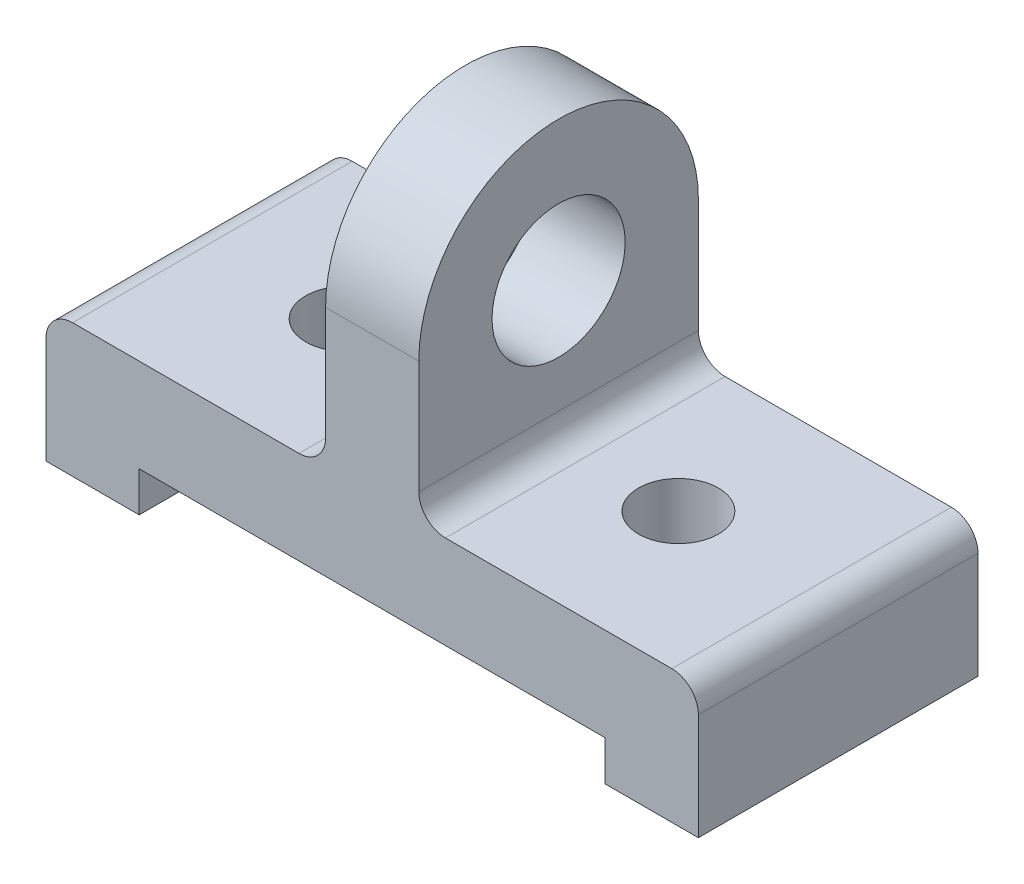
ISO-10303-21;
HEADER;
FILE_DESCRIPTION(('STEP AP214'),'2;1');
FILE_NAME('part.step','',(''),(''),'','','');
FILE_SCHEMA(('AUTOMOTIVE_DESIGN { 1 0 10303 214 1 1 1 1 }'));
ENDSEC;
DATA;
#1=APPLICATION_CONTEXT('core data for automotive mechanical design processes');
#2=APPLICATION_PROTOCOL_DEFINITION('international standard','automotive_design',2000,#1);
#3=PRODUCT_CONTEXT('',#1,'mechanical');
#4=PRODUCT('Part','Part','',(#3));
#5=PRODUCT_RELATED_PRODUCT_CATEGORY('part','',(#4));
#6=PRODUCT_DEFINITION_FORMATION('','',#4);
#7=PRODUCT_DEFINITION_CONTEXT('part definition',#1,'design');
#8=PRODUCT_DEFINITION('design','',#6,#7);
#9=PRODUCT_DEFINITION_SHAPE('','',#8);
#10=(LENGTH_UNIT() NAMED_UNIT(*) SI_UNIT(.MILLI.,.METRE.));
#11=(NAMED_UNIT(*) PLANE_ANGLE_UNIT() SI_UNIT($,.RADIAN.));
#12=(NAMED_UNIT(*) SI_UNIT($,.STERADIAN.) SOLID_ANGLE_UNIT());
#13=UNCERTAINTY_MEASURE_WITH_UNIT(LENGTH_MEASURE(1.E-05),#10,'distance_accuracy_value','');
#14=(GEOMETRIC_REPRESENTATION_CONTEXT(3) GLOBAL_UNCERTAINTY_ASSIGNED_CONTEXT((#13)) GLOBAL_UNIT_ASSIGNED_CONTEXT((#10,
#11,#12)) REPRESENTATION_CONTEXT('',''));
#15=CARTESIAN_POINT('',(0.,0.,0.));
#16=DIRECTION('',(0.,0.,1.));
#17=DIRECTION('',(1.,0.,0.));
#18=AXIS2_PLACEMENT_3D('',#15,#16,#17);
#19=CARTESIAN_POINT('',(0.,0.,42.));
#20=DIRECTION('',(0.,1.,0.));
#21=DIRECTION('',(-1.,0.,0.));
#22=AXIS2_PLACEMENT_3D('',#19,#20,#21);
#23=PLANE('',#22);
#24=CARTESIAN_POINT('',(-10.,0.,21.));
#25=DIRECTION('',(0.,1.,0.));
#26=DIRECTION('',(-1.,0.,0.));
#27=AXIS2_PLACEMENT_3D('',#24,#25,#26);
#28=CIRCLE('',#27,6.);
#29=CARTESIAN_POINT('',(-16.,0.,21.));
#30=VERTEX_POINT('',#29);
#31=EDGE_CURVE('E262',#30,#30,#28,.T.);
#32=ORIENTED_EDGE('',*,*,#31,.T.);
#33=EDGE_LOOP('',(#32));
#34=FACE_BOUND('',#33,.T.);
#35=DIRECTION('',(1.,0.,0.));
#36=VECTOR('',#35,1.);
#37=CARTESIAN_POINT('',(0.,0.,0.));
#38=LINE('',#37,#36);
#39=CARTESIAN_POINT('',(-70.,0.,0.));
#40=VERTEX_POINT('',#39);
#41=CARTESIAN_POINT('',(0.,0.,0.));
#42=VERTEX_POINT('',#41);
#43=EDGE_CURVE('E164',#40,#42,#38,.T.);
#44=ORIENTED_EDGE('',*,*,#43,.T.);
#45=DIRECTION('',(0.,0.,-1.));
#46=VECTOR('',#45,1.);
#47=CARTESIAN_POINT('',(0.,0.,42.));
#48=LINE('',#47,#46);
#49=CARTESIAN_POINT('',(0.,0.,42.));
#50=VERTEX_POINT('',#49);
#51=EDGE_CURVE('E322',#50,#42,#48,.T.);
#52=ORIENTED_EDGE('',*,*,#51,.F.);
#53=DIRECTION('',(1.,0.,0.));
#54=VECTOR('',#53,1.);
#55=CARTESIAN_POINT('',(0.,0.,42.));
#56=LINE('',#55,#54);
#57=CARTESIAN_POINT('',(-70.,0.,42.));
#58=VERTEX_POINT('',#57);
#59=EDGE_CURVE('E281',#58,#50,#56,.T.);
#60=ORIENTED_EDGE('',*,*,#59,.F.);
#61=DIRECTION('',(0.,0.,-1.));
#62=VECTOR('',#61,1.);
#63=CARTESIAN_POINT('',(-70.,0.,42.));
#64=LINE('',#63,#62);
#65=EDGE_CURVE('E228',#58,#40,#64,.T.);
#66=ORIENTED_EDGE('',*,*,#65,.T.);
#67=EDGE_LOOP('',(#44,#52,#60,#66));
#68=FACE_BOUND('',#67,.T.);
#69=CARTESIAN_POINT('',(-60.,0.,21.));
#70=DIRECTION('',(0.,-1.,0.));
#71=DIRECTION('',(1.,0.,0.));
#72=AXIS2_PLACEMENT_3D('',#69,#70,#71);
#73=CIRCLE('',#72,6.);
#74=CARTESIAN_POINT('',(-54.,0.,21.));
#75=VERTEX_POINT('',#74);
#76=EDGE_CURVE('E547',#75,#75,#73,.T.);
#77=ORIENTED_EDGE('',*,*,#76,.F.);
#78=EDGE_LOOP('',(#77));
#79=FACE_BOUND('',#78,.T.);
#80=ADVANCED_FACE('F39',(#34,#68,#79),#23,.F.);
#81=CARTESIAN_POINT('',(0.,0.,42.));
#82=DIRECTION('',(1.,0.,0.));
#83=DIRECTION('',(0.,1.,0.));
#84=AXIS2_PLACEMENT_3D('',#81,#82,#83);
#85=PLANE('',#84);
#86=DIRECTION('',(0.,-1.,0.));
#87=VECTOR('',#86,1.);
#88=CARTESIAN_POINT('',(0.,0.,0.));
#89=LINE('',#88,#87);
#90=CARTESIAN_POINT('',(0.,-6.,0.));
#91=VERTEX_POINT('',#90);
#92=EDGE_CURVE('E303',#42,#91,#89,.T.);
#93=ORIENTED_EDGE('',*,*,#92,.T.);
#94=DIRECTION('',(0.,0.,-1.));
#95=VECTOR('',#94,1.);
#96=CARTESIAN_POINT('',(0.,-6.,42.));
#97=LINE('',#96,#95);
#98=CARTESIAN_POINT('',(0.,-6.,42.));
#99=VERTEX_POINT('',#98);
#100=EDGE_CURVE('E318',#99,#91,#97,.T.);
#101=ORIENTED_EDGE('',*,*,#100,.F.);
#102=DIRECTION('',(0.,-1.,0.));
#103=VECTOR('',#102,1.);
#104=CARTESIAN_POINT('',(0.,0.,42.));
#105=LINE('',#104,#103);
#106=EDGE_CURVE('E285',#50,#99,#105,.T.);
#107=ORIENTED_EDGE('',*,*,#106,.F.);
#108=ORIENTED_EDGE('',*,*,#51,.T.);
#109=EDGE_LOOP('',(#93,#101,#107,#108));
#110=FACE_BOUND('',#109,.T.);
#111=ADVANCED_FACE('F368',(#110),#85,.F.);
#112=CARTESIAN_POINT('',(0.,-6.,42.));
#113=DIRECTION('',(0.,1.,0.));
#114=DIRECTION('',(0.,0.,1.));
#115=AXIS2_PLACEMENT_3D('',#112,#113,#114);
#116=PLANE('',#115);
#117=DIRECTION('',(1.,0.,0.));
#118=VECTOR('',#117,1.);
#119=CARTESIAN_POINT('',(0.,-6.,0.));
#120=LINE('',#119,#118);
#121=CARTESIAN_POINT('',(14.,-6.,0.));
#122=VERTEX_POINT('',#121);
#123=EDGE_CURVE('E306',#91,#122,#120,.T.);
#124=ORIENTED_EDGE('',*,*,#123,.T.);
#125=DIRECTION('',(0.,0.,-1.));
#126=VECTOR('',#125,1.);
#127=CARTESIAN_POINT('',(14.,-6.,42.));
#128=LINE('',#127,#126);
#129=CARTESIAN_POINT('',(14.,-6.,42.));
#130=VERTEX_POINT('',#129);
#131=EDGE_CURVE('E299',#130,#122,#128,.T.);
#132=ORIENTED_EDGE('',*,*,#131,.F.);
#133=DIRECTION('',(1.,0.,0.));
#134=VECTOR('',#133,1.);
#135=CARTESIAN_POINT('',(0.,-6.,42.));
#136=LINE('',#135,#134);
#137=EDGE_CURVE('E289',#99,#130,#136,.T.);
#138=ORIENTED_EDGE('',*,*,#137,.F.);
#139=ORIENTED_EDGE('',*,*,#100,.T.);
#140=EDGE_LOOP('',(#124,#132,#138,#139));
#141=FACE_BOUND('',#140,.T.);
#142=ADVANCED_FACE('F365',(#141),#116,.F.);
#143=CARTESIAN_POINT('',(14.,-6.,42.));
#144=DIRECTION('',(-1.,0.,0.));
#145=DIRECTION('',(0.,0.,1.));
#146=AXIS2_PLACEMENT_3D('',#143,#144,#145);
#147=PLANE('',#146);
#148=DIRECTION('',(0.,1.,0.));
#149=VECTOR('',#148,1.);
#150=CARTESIAN_POINT('',(14.,-6.,0.));
#151=LINE('',#150,#149);
#152=CARTESIAN_POINT('',(14.,10.,0.));
#153=VERTEX_POINT('',#152);
#154=EDGE_CURVE('E309',#122,#153,#151,.T.);
#155=ORIENTED_EDGE('',*,*,#154,.T.);
#156=DIRECTION('',(0.,0.,-1.));
#157=VECTOR('',#156,1.);
#158=CARTESIAN_POINT('',(14.,10.,42.));
#159=LINE('',#158,#157);
#160=CARTESIAN_POINT('',(14.,10.,42.));
#161=VERTEX_POINT('',#160);
#162=EDGE_CURVE('E55',#153,#161,#159,.F.);
#163=ORIENTED_EDGE('',*,*,#162,.T.);
#164=DIRECTION('',(0.,1.,0.));
#165=VECTOR('',#164,1.);
#166=CARTESIAN_POINT('',(14.,-6.,42.));
#167=LINE('',#166,#165);
#168=EDGE_CURVE('E292',#130,#161,#167,.T.);
#169=ORIENTED_EDGE('',*,*,#168,.F.);
#170=ORIENTED_EDGE('',*,*,#131,.T.);
#171=EDGE_LOOP('',(#155,#163,#169,#170));
#172=FACE_BOUND('',#171,.T.);
#173=ADVANCED_FACE('F362',(#172),#147,.F.);
#174=CARTESIAN_POINT('',(14.,14.,42.));
#175=DIRECTION('',(0.,-1.,0.));
#176=DIRECTION('',(1.,0.,0.));
#177=AXIS2_PLACEMENT_3D('',#174,#175,#176);
#178=PLANE('',#177);
#179=CARTESIAN_POINT('',(-10.,14.,21.));
#180=DIRECTION('',(0.,1.,0.));
#181=DIRECTION('',(-1.,0.,0.));
#182=AXIS2_PLACEMENT_3D('',#179,#180,#181);
#183=CIRCLE('',#182,6.);
#184=CARTESIAN_POINT('',(-16.,14.,21.));
#185=VERTEX_POINT('',#184);
#186=EDGE_CURVE('E258',#185,#185,#183,.T.);
#187=ORIENTED_EDGE('',*,*,#186,.F.);
#188=EDGE_LOOP('',(#187));
#189=FACE_BOUND('',#188,.T.);
#190=DIRECTION('',(-1.,0.,0.));
#191=VECTOR('',#190,1.);
#192=CARTESIAN_POINT('',(14.,14.,0.));
#193=LINE('',#192,#191);
#194=CARTESIAN_POINT('',(10.,14.,0.));
#195=VERTEX_POINT('',#194);
#196=CARTESIAN_POINT('',(-24.,14.,0.));
#197=VERTEX_POINT('',#196);
#198=EDGE_CURVE('E286',#195,#197,#193,.T.);
#199=ORIENTED_EDGE('',*,*,#198,.T.);
#200=DIRECTION('',(0.,0.,1.));
#201=VECTOR('',#200,1.);
#202=CARTESIAN_POINT('',(-24.,14.,42.));
#203=LINE('',#202,#201);
#204=CARTESIAN_POINT('',(-24.,14.,42.));
#205=VERTEX_POINT('',#204);
#206=EDGE_CURVE('E330',#197,#205,#203,.T.);
#207=ORIENTED_EDGE('',*,*,#206,.T.);
#208=DIRECTION('',(-1.,0.,0.));
#209=VECTOR('',#208,1.);
#210=CARTESIAN_POINT('',(14.,14.,42.));
#211=LINE('',#210,#209);
#212=CARTESIAN_POINT('',(10.,14.,42.));
#213=VERTEX_POINT('',#212);
#214=EDGE_CURVE('E295',#213,#205,#211,.T.);
#215=ORIENTED_EDGE('',*,*,#214,.F.);
#216=DIRECTION('',(0.,0.,-1.));
#217=VECTOR('',#216,1.);
#218=CARTESIAN_POINT('',(10.,14.,42.));
#219=LINE('',#218,#217);
#220=EDGE_CURVE('E326',#213,#195,#219,.T.);
#221=ORIENTED_EDGE('',*,*,#220,.T.);
#222=EDGE_LOOP('',(#199,#207,#215,#221));
#223=FACE_BOUND('',#222,.T.);
#224=ADVANCED_FACE('F356',(#189,#223),#178,.F.);
#225=CARTESIAN_POINT('',(0.,0.,42.));
#226=DIRECTION('',(0.,0.,1.));
#227=DIRECTION('',(1.,0.,0.));
#228=AXIS2_PLACEMENT_3D('',#225,#226,#227);
#229=PLANE('',#228);
#230=ORIENTED_EDGE('',*,*,#168,.T.);
#231=CARTESIAN_POINT('',(10.,10.,42.));
#232=DIRECTION('',(0.,0.,1.));
#233=DIRECTION('',(1.,0.,0.));
#234=AXIS2_PLACEMENT_3D('',#231,#232,#233);
#235=CIRCLE('',#234,4.);
#236=EDGE_CURVE('E341',#161,#213,#235,.T.);
#237=ORIENTED_EDGE('',*,*,#236,.T.);
#238=ORIENTED_EDGE('',*,*,#214,.T.);
#239=CARTESIAN_POINT('',(-24.,18.,42.));
#240=DIRECTION('',(0.,0.,1.));
#241=DIRECTION('',(1.,0.,0.));
#242=AXIS2_PLACEMENT_3D('',#239,#240,#241);
#243=CIRCLE('',#242,4.);
#244=CARTESIAN_POINT('',(-28.,18.,42.));
#245=VERTEX_POINT('',#244);
#246=EDGE_CURVE('E48',#205,#245,#243,.F.);
#247=ORIENTED_EDGE('',*,*,#246,.T.);
#248=DIRECTION('',(0.,1.,0.));
#249=VECTOR('',#248,1.);
#250=CARTESIAN_POINT('',(-28.,14.,42.));
#251=LINE('',#250,#249);
#252=CARTESIAN_POINT('',(-28.,35.,42.));
#253=VERTEX_POINT('',#252);
#254=EDGE_CURVE('E160',#245,#253,#251,.T.);
#255=ORIENTED_EDGE('',*,*,#254,.T.);
#256=DIRECTION('',(1.,0.,0.));
#257=VECTOR('',#256,1.);
#258=CARTESIAN_POINT('',(-35.,35.,42.));
#259=LINE('',#258,#257);
#260=CARTESIAN_POINT('',(-42.,35.,42.));
#261=VERTEX_POINT('',#260);
#262=EDGE_CURVE('E154',#261,#253,#259,.T.);
#263=ORIENTED_EDGE('',*,*,#262,.F.);
#264=DIRECTION('',(0.,1.,0.));
#265=VECTOR('',#264,1.);
#266=CARTESIAN_POINT('',(-42.,14.,42.));
#267=LINE('',#266,#265);
#268=CARTESIAN_POINT('',(-42.,18.,42.));
#269=VERTEX_POINT('',#268);
#270=EDGE_CURVE('E158',#269,#261,#267,.T.);
#271=ORIENTED_EDGE('',*,*,#270,.F.);
#272=CARTESIAN_POINT('',(-46.,18.,42.));
#273=DIRECTION('',(0.,0.,-1.));
#274=DIRECTION('',(-1.,0.,0.));
#275=AXIS2_PLACEMENT_3D('',#272,#273,#274);
#276=CIRCLE('',#275,4.);
#277=CARTESIAN_POINT('',(-46.,14.,42.));
#278=VERTEX_POINT('',#277);
#279=EDGE_CURVE('E252',#278,#269,#276,.F.);
#280=ORIENTED_EDGE('',*,*,#279,.F.);
#281=DIRECTION('',(1.,0.,0.));
#282=VECTOR('',#281,1.);
#283=CARTESIAN_POINT('',(-84.,14.,42.));
#284=LINE('',#283,#282);
#285=CARTESIAN_POINT('',(-80.,14.,42.));
#286=VERTEX_POINT('',#285);
#287=EDGE_CURVE('E202',#286,#278,#284,.T.);
#288=ORIENTED_EDGE('',*,*,#287,.F.);
#289=CARTESIAN_POINT('',(-80.,10.,42.));
#290=DIRECTION('',(0.,0.,-1.));
#291=DIRECTION('',(-1.,0.,0.));
#292=AXIS2_PLACEMENT_3D('',#289,#290,#291);
#293=CIRCLE('',#292,4.);
#294=CARTESIAN_POINT('',(-84.,10.,42.));
#295=VERTEX_POINT('',#294);
#296=EDGE_CURVE('E249',#295,#286,#293,.T.);
#297=ORIENTED_EDGE('',*,*,#296,.F.);
#298=DIRECTION('',(0.,1.,0.));
#299=VECTOR('',#298,1.);
#300=CARTESIAN_POINT('',(-84.,-6.,42.));
#301=LINE('',#300,#299);
#302=CARTESIAN_POINT('',(-84.,-6.,42.));
#303=VERTEX_POINT('',#302);
#304=EDGE_CURVE('E198',#303,#295,#301,.T.);
#305=ORIENTED_EDGE('',*,*,#304,.F.);
#306=DIRECTION('',(-1.,0.,0.));
#307=VECTOR('',#306,1.);
#308=CARTESIAN_POINT('',(-70.,-6.,42.));
#309=LINE('',#308,#307);
#310=CARTESIAN_POINT('',(-70.,-6.,42.));
#311=VERTEX_POINT('',#310);
#312=EDGE_CURVE('E193',#311,#303,#309,.T.);
#313=ORIENTED_EDGE('',*,*,#312,.F.);
#314=DIRECTION('',(0.,-1.,0.));
#315=VECTOR('',#314,1.);
#316=CARTESIAN_POINT('',(-70.,0.,42.));
#317=LINE('',#316,#315);
#318=EDGE_CURVE('E189',#58,#311,#317,.T.);
#319=ORIENTED_EDGE('',*,*,#318,.F.);
#320=ORIENTED_EDGE('',*,*,#59,.T.);
#321=ORIENTED_EDGE('',*,*,#106,.T.);
#322=ORIENTED_EDGE('',*,*,#137,.T.);
#323=EDGE_LOOP('',(#230,#237,#238,#247,#255,#263,#271,#280,#288,#297,#305,#313,#319,#320,#321,#322));
#324=FACE_BOUND('',#323,.T.);
#325=ADVANCED_FACE('F156',(#324),#229,.T.);
#326=CARTESIAN_POINT('',(0.,0.,0.));
#327=DIRECTION('',(0.,0.,1.));
#328=DIRECTION('',(1.,0.,0.));
#329=AXIS2_PLACEMENT_3D('',#326,#327,#328);
#330=PLANE('',#329);
#331=ORIENTED_EDGE('',*,*,#198,.F.);
#332=CARTESIAN_POINT('',(10.,10.,0.));
#333=DIRECTION('',(0.,0.,1.));
#334=DIRECTION('',(1.,0.,0.));
#335=AXIS2_PLACEMENT_3D('',#332,#333,#334);
#336=CIRCLE('',#335,4.);
#337=EDGE_CURVE('E63',#195,#153,#336,.F.);
#338=ORIENTED_EDGE('',*,*,#337,.T.);
#339=ORIENTED_EDGE('',*,*,#154,.F.);
#340=ORIENTED_EDGE('',*,*,#123,.F.);
#341=ORIENTED_EDGE('',*,*,#92,.F.);
#342=ORIENTED_EDGE('',*,*,#43,.F.);
#343=DIRECTION('',(0.,-1.,0.));
#344=VECTOR('',#343,1.);
#345=CARTESIAN_POINT('',(-70.,0.,0.));
#346=LINE('',#345,#344);
#347=CARTESIAN_POINT('',(-70.,-6.,0.));
#348=VERTEX_POINT('',#347);
#349=EDGE_CURVE('E175',#40,#348,#346,.T.);
#350=ORIENTED_EDGE('',*,*,#349,.T.);
#351=DIRECTION('',(-1.,0.,0.));
#352=VECTOR('',#351,1.);
#353=CARTESIAN_POINT('',(-70.,-6.,0.));
#354=LINE('',#353,#352);
#355=CARTESIAN_POINT('',(-84.,-6.,0.));
#356=VERTEX_POINT('',#355);
#357=EDGE_CURVE('E210',#348,#356,#354,.T.);
#358=ORIENTED_EDGE('',*,*,#357,.T.);
#359=DIRECTION('',(0.,1.,0.));
#360=VECTOR('',#359,1.);
#361=CARTESIAN_POINT('',(-84.,-6.,0.));
#362=LINE('',#361,#360);
#363=CARTESIAN_POINT('',(-84.,10.,0.));
#364=VERTEX_POINT('',#363);
#365=EDGE_CURVE('E214',#356,#364,#362,.T.);
#366=ORIENTED_EDGE('',*,*,#365,.T.);
#367=CARTESIAN_POINT('',(-80.,10.,0.));
#368=DIRECTION('',(0.,0.,-1.));
#369=DIRECTION('',(-1.,0.,0.));
#370=AXIS2_PLACEMENT_3D('',#367,#368,#369);
#371=CIRCLE('',#370,4.);
#372=CARTESIAN_POINT('',(-80.,14.,0.));
#373=VERTEX_POINT('',#372);
#374=EDGE_CURVE('E242',#373,#364,#371,.F.);
#375=ORIENTED_EDGE('',*,*,#374,.F.);
#376=DIRECTION('',(1.,0.,0.));
#377=VECTOR('',#376,1.);
#378=CARTESIAN_POINT('',(-84.,14.,0.));
#379=LINE('',#378,#377);
#380=CARTESIAN_POINT('',(-46.,14.,0.));
#381=VERTEX_POINT('',#380);
#382=EDGE_CURVE('E194',#373,#381,#379,.T.);
#383=ORIENTED_EDGE('',*,*,#382,.T.);
#384=CARTESIAN_POINT('',(-46.,18.,0.));
#385=DIRECTION('',(0.,0.,-1.));
#386=DIRECTION('',(-1.,0.,0.));
#387=AXIS2_PLACEMENT_3D('',#384,#385,#386);
#388=CIRCLE('',#387,4.);
#389=CARTESIAN_POINT('',(-42.,18.,0.));
#390=VERTEX_POINT('',#389);
#391=EDGE_CURVE('E255',#390,#381,#388,.T.);
#392=ORIENTED_EDGE('',*,*,#391,.F.);
#393=DIRECTION('',(0.,-1.,0.));
#394=VECTOR('',#393,1.);
#395=CARTESIAN_POINT('',(-42.,35.,0.));
#396=LINE('',#395,#394);
#397=CARTESIAN_POINT('',(-42.,35.,0.));
#398=VERTEX_POINT('',#397);
#399=EDGE_CURVE('E182',#398,#390,#396,.T.);
#400=ORIENTED_EDGE('',*,*,#399,.F.);
#401=DIRECTION('',(1.,0.,0.));
#402=VECTOR('',#401,1.);
#403=CARTESIAN_POINT('',(-35.,35.,0.));
#404=LINE('',#403,#402);
#405=CARTESIAN_POINT('',(-28.,35.,0.));
#406=VERTEX_POINT('',#405);
#407=EDGE_CURVE('E165',#398,#406,#404,.T.);
#408=ORIENTED_EDGE('',*,*,#407,.T.);
#409=DIRECTION('',(0.,-1.,0.));
#410=VECTOR('',#409,1.);
#411=CARTESIAN_POINT('',(-28.,35.,0.));
#412=LINE('',#411,#410);
#413=CARTESIAN_POINT('',(-28.,18.,0.));
#414=VERTEX_POINT('',#413);
#415=EDGE_CURVE('E270',#406,#414,#412,.T.);
#416=ORIENTED_EDGE('',*,*,#415,.T.);
#417=CARTESIAN_POINT('',(-24.,18.,0.));
#418=DIRECTION('',(0.,0.,1.));
#419=DIRECTION('',(1.,0.,0.));
#420=AXIS2_PLACEMENT_3D('',#417,#418,#419);
#421=CIRCLE('',#420,4.);
#422=EDGE_CURVE('E11',#414,#197,#421,.T.);
#423=ORIENTED_EDGE('',*,*,#422,.T.);
#424=EDGE_LOOP('',(#331,#338,#339,#340,#341,#342,#350,#358,#366,#375,#383,#392,#400,#408,#416,#423));
#425=FACE_BOUND('',#424,.T.);
#426=ADVANCED_FACE('F354',(#425),#330,.F.);
#427=CARTESIAN_POINT('',(-28.,35.,21.));
#428=DIRECTION('',(-1.,0.,0.));
#429=DIRECTION('',(0.,0.,1.));
#430=AXIS2_PLACEMENT_3D('',#427,#428,#429);
#431=PLANE('',#430);
#432=ORIENTED_EDGE('',*,*,#254,.F.);
#433=DIRECTION('',(0.,0.,1.));
#434=VECTOR('',#433,1.);
#435=CARTESIAN_POINT('',(-28.,18.,0.));
#436=LINE('',#435,#434);
#437=EDGE_CURVE('E334',#245,#414,#436,.F.);
#438=ORIENTED_EDGE('',*,*,#437,.T.);
#439=ORIENTED_EDGE('',*,*,#415,.F.);
#440=CARTESIAN_POINT('',(-28.,35.,21.));
#441=DIRECTION('',(-1.,0.,0.));
#442=DIRECTION('',(0.,0.,1.));
#443=AXIS2_PLACEMENT_3D('',#440,#441,#442);
#444=CIRCLE('',#443,21.);
#445=EDGE_CURVE('E276',#253,#406,#444,.T.);
#446=ORIENTED_EDGE('',*,*,#445,.F.);
#447=EDGE_LOOP('',(#432,#438,#439,#446));
#448=FACE_BOUND('',#447,.T.);
#449=CARTESIAN_POINT('',(-28.,35.,21.));
#450=DIRECTION('',(-1.,0.,0.));
#451=DIRECTION('',(0.,0.,1.));
#452=AXIS2_PLACEMENT_3D('',#449,#450,#451);
#453=CIRCLE('',#452,10.);
#454=CARTESIAN_POINT('',(-28.,35.,31.));
#455=VERTEX_POINT('',#454);
#456=EDGE_CURVE('E266',#455,#455,#453,.T.);
#457=ORIENTED_EDGE('',*,*,#456,.T.);
#458=EDGE_LOOP('',(#457));
#459=FACE_BOUND('',#458,.T.);
#460=ADVANCED_FACE('F349',(#448,#459),#431,.F.);
#461=CARTESIAN_POINT('',(-35.,35.,21.));
#462=DIRECTION('',(1.,0.,0.));
#463=DIRECTION('',(0.,0.,-1.));
#464=AXIS2_PLACEMENT_3D('',#461,#462,#463);
#465=CYLINDRICAL_SURFACE('',#464,21.);
#466=ORIENTED_EDGE('',*,*,#445,.T.);
#467=ORIENTED_EDGE('',*,*,#407,.F.);
#468=CARTESIAN_POINT('',(-42.,35.,21.));
#469=DIRECTION('',(-1.,0.,0.));
#470=DIRECTION('',(0.,0.,1.));
#471=AXIS2_PLACEMENT_3D('',#468,#469,#470);
#472=CIRCLE('',#471,21.);
#473=EDGE_CURVE('E168',#261,#398,#472,.T.);
#474=ORIENTED_EDGE('',*,*,#473,.F.);
#475=ORIENTED_EDGE('',*,*,#262,.T.);
#476=EDGE_LOOP('',(#466,#467,#474,#475));
#477=FACE_BOUND('',#476,.T.);
#478=ADVANCED_FACE('F169',(#477),#465,.T.);
#479=CARTESIAN_POINT('',(-35.,35.,21.));
#480=DIRECTION('',(1.,0.,0.));
#481=DIRECTION('',(0.,0.,-1.));
#482=AXIS2_PLACEMENT_3D('',#479,#480,#481);
#483=CYLINDRICAL_SURFACE('',#482,10.);
#484=ORIENTED_EDGE('',*,*,#456,.F.);
#485=EDGE_LOOP('',(#484));
#486=FACE_BOUND('',#485,.T.);
#487=CARTESIAN_POINT('',(-42.,35.,21.));
#488=DIRECTION('',(-1.,0.,0.));
#489=DIRECTION('',(0.,0.,1.));
#490=AXIS2_PLACEMENT_3D('',#487,#488,#489);
#491=CIRCLE('',#490,10.);
#492=CARTESIAN_POINT('',(-42.,35.,31.));
#493=VERTEX_POINT('',#492);
#494=EDGE_CURVE('E185',#493,#493,#491,.T.);
#495=ORIENTED_EDGE('',*,*,#494,.T.);
#496=EDGE_LOOP('',(#495));
#497=FACE_BOUND('',#496,.T.);
#498=ADVANCED_FACE('F420',(#486,#497),#483,.F.);
#499=CARTESIAN_POINT('',(-10.,-6.00000000000001,21.));
#500=DIRECTION('',(0.,1.,0.));
#501=DIRECTION('',(-1.,0.,0.));
#502=AXIS2_PLACEMENT_3D('',#499,#500,#501);
#503=CYLINDRICAL_SURFACE('',#502,6.);
#504=ORIENTED_EDGE('',*,*,#186,.T.);
#505=EDGE_LOOP('',(#504));
#506=FACE_BOUND('',#505,.T.);
#507=ORIENTED_EDGE('',*,*,#31,.F.);
#508=EDGE_LOOP('',(#507));
#509=FACE_BOUND('',#508,.T.);
#510=ADVANCED_FACE('F415',(#506,#509),#503,.F.);
#511=CARTESIAN_POINT('',(-24.,18.,42.));
#512=DIRECTION('',(0.,0.,-1.));
#513=DIRECTION('',(-1.,0.,0.));
#514=AXIS2_PLACEMENT_3D('',#511,#512,#513);
#515=CYLINDRICAL_SURFACE('',#514,4.);
#516=ORIENTED_EDGE('',*,*,#422,.F.);
#517=ORIENTED_EDGE('',*,*,#437,.F.);
#518=ORIENTED_EDGE('',*,*,#246,.F.);
#519=ORIENTED_EDGE('',*,*,#206,.F.);
#520=EDGE_LOOP('',(#516,#517,#518,#519));
#521=FACE_BOUND('',#520,.T.);
#522=ADVANCED_FACE('F353',(#521),#515,.F.);
#523=CARTESIAN_POINT('',(10.,10.,42.));
#524=DIRECTION('',(0.,0.,-1.));
#525=DIRECTION('',(-1.,0.,0.));
#526=AXIS2_PLACEMENT_3D('',#523,#524,#525);
#527=CYLINDRICAL_SURFACE('',#526,4.);
#528=ORIENTED_EDGE('',*,*,#236,.F.);
#529=ORIENTED_EDGE('',*,*,#162,.F.);
#530=ORIENTED_EDGE('',*,*,#337,.F.);
#531=ORIENTED_EDGE('',*,*,#220,.F.);
#532=EDGE_LOOP('',(#528,#529,#530,#531));
#533=FACE_BOUND('',#532,.T.);
#534=ADVANCED_FACE('F41',(#533),#527,.T.);
#535=CARTESIAN_POINT('',(-70.,0.,42.));
#536=DIRECTION('',(-1.,0.,0.));
#537=DIRECTION('',(0.,1.,0.));
#538=AXIS2_PLACEMENT_3D('',#535,#536,#537);
#539=PLANE('',#538);
#540=ORIENTED_EDGE('',*,*,#349,.F.);
#541=ORIENTED_EDGE('',*,*,#65,.F.);
#542=ORIENTED_EDGE('',*,*,#318,.T.);
#543=DIRECTION('',(0.,0.,-1.));
#544=VECTOR('',#543,1.);
#545=CARTESIAN_POINT('',(-70.,-6.,42.));
#546=LINE('',#545,#544);
#547=EDGE_CURVE('E224',#311,#348,#546,.T.);
#548=ORIENTED_EDGE('',*,*,#547,.T.);
#549=EDGE_LOOP('',(#540,#541,#542,#548));
#550=FACE_BOUND('',#549,.T.);
#551=ADVANCED_FACE('F375',(#550),#539,.F.);
#552=CARTESIAN_POINT('',(-70.,-6.,42.));
#553=DIRECTION('',(0.,1.,0.));
#554=DIRECTION('',(0.,0.,1.));
#555=AXIS2_PLACEMENT_3D('',#552,#553,#554);
#556=PLANE('',#555);
#557=ORIENTED_EDGE('',*,*,#357,.F.);
#558=ORIENTED_EDGE('',*,*,#547,.F.);
#559=ORIENTED_EDGE('',*,*,#312,.T.);
#560=DIRECTION('',(0.,0.,-1.));
#561=VECTOR('',#560,1.);
#562=CARTESIAN_POINT('',(-84.,-6.,42.));
#563=LINE('',#562,#561);
#564=EDGE_CURVE('E206',#303,#356,#563,.T.);
#565=ORIENTED_EDGE('',*,*,#564,.T.);
#566=EDGE_LOOP('',(#557,#558,#559,#565));
#567=FACE_BOUND('',#566,.T.);
#568=ADVANCED_FACE('F379',(#567),#556,.F.);
#569=CARTESIAN_POINT('',(-84.,-6.,42.));
#570=DIRECTION('',(1.,0.,0.));
#571=DIRECTION('',(0.,0.,1.));
#572=AXIS2_PLACEMENT_3D('',#569,#570,#571);
#573=PLANE('',#572);
#574=ORIENTED_EDGE('',*,*,#365,.F.);
#575=ORIENTED_EDGE('',*,*,#564,.F.);
#576=ORIENTED_EDGE('',*,*,#304,.T.);
#577=DIRECTION('',(0.,0.,-1.));
#578=VECTOR('',#577,1.);
#579=CARTESIAN_POINT('',(-84.,10.,42.));
#580=LINE('',#579,#578);
#581=EDGE_CURVE('E245',#364,#295,#580,.F.);
#582=ORIENTED_EDGE('',*,*,#581,.F.);
#583=EDGE_LOOP('',(#574,#575,#576,#582));
#584=FACE_BOUND('',#583,.T.);
#585=ADVANCED_FACE('F383',(#584),#573,.F.);
#586=CARTESIAN_POINT('',(-84.,14.,42.));
#587=DIRECTION('',(0.,-1.,0.));
#588=DIRECTION('',(-1.,0.,0.));
#589=AXIS2_PLACEMENT_3D('',#586,#587,#588);
#590=PLANE('',#589);
#591=CARTESIAN_POINT('',(-60.,14.,21.));
#592=DIRECTION('',(0.,-1.,0.));
#593=DIRECTION('',(1.,0.,0.));
#594=AXIS2_PLACEMENT_3D('',#591,#592,#593);
#595=CIRCLE('',#594,6.);
#596=CARTESIAN_POINT('',(-54.,14.,21.));
#597=VERTEX_POINT('',#596);
#598=EDGE_CURVE('E545',#597,#597,#595,.T.);
#599=ORIENTED_EDGE('',*,*,#598,.T.);
#600=EDGE_LOOP('',(#599));
#601=FACE_BOUND('',#600,.T.);
#602=ORIENTED_EDGE('',*,*,#382,.F.);
#603=DIRECTION('',(0.,0.,-1.));
#604=VECTOR('',#603,1.);
#605=CARTESIAN_POINT('',(-80.,14.,42.));
#606=LINE('',#605,#604);
#607=EDGE_CURVE('E232',#286,#373,#606,.T.);
#608=ORIENTED_EDGE('',*,*,#607,.F.);
#609=ORIENTED_EDGE('',*,*,#287,.T.);
#610=DIRECTION('',(0.,0.,1.));
#611=VECTOR('',#610,1.);
#612=CARTESIAN_POINT('',(-46.,14.,42.));
#613=LINE('',#612,#611);
#614=EDGE_CURVE('E236',#381,#278,#613,.T.);
#615=ORIENTED_EDGE('',*,*,#614,.F.);
#616=EDGE_LOOP('',(#602,#608,#609,#615));
#617=FACE_BOUND('',#616,.T.);
#618=ADVANCED_FACE('F391',(#601,#617),#590,.F.);
#619=CARTESIAN_POINT('',(-42.,35.,21.));
#620=DIRECTION('',(1.,0.,0.));
#621=DIRECTION('',(0.,0.,1.));
#622=AXIS2_PLACEMENT_3D('',#619,#620,#621);
#623=PLANE('',#622);
#624=ORIENTED_EDGE('',*,*,#270,.T.);
#625=ORIENTED_EDGE('',*,*,#473,.T.);
#626=ORIENTED_EDGE('',*,*,#399,.T.);
#627=DIRECTION('',(0.,0.,1.));
#628=VECTOR('',#627,1.);
#629=CARTESIAN_POINT('',(-42.,18.,0.));
#630=LINE('',#629,#628);
#631=EDGE_CURVE('E179',#269,#390,#630,.F.);
#632=ORIENTED_EDGE('',*,*,#631,.F.);
#633=EDGE_LOOP('',(#624,#625,#626,#632));
#634=FACE_BOUND('',#633,.T.);
#635=ORIENTED_EDGE('',*,*,#494,.F.);
#636=EDGE_LOOP('',(#635));
#637=FACE_BOUND('',#636,.T.);
#638=ADVANCED_FACE('F177',(#634,#637),#623,.F.);
#639=CARTESIAN_POINT('',(-60.,-6.00000000000001,21.));
#640=DIRECTION('',(0.,1.,0.));
#641=DIRECTION('',(1.,0.,0.));
#642=AXIS2_PLACEMENT_3D('',#639,#640,#641);
#643=CYLINDRICAL_SURFACE('',#642,6.);
#644=ORIENTED_EDGE('',*,*,#598,.F.);
#645=EDGE_LOOP('',(#644));
#646=FACE_BOUND('',#645,.T.);
#647=ORIENTED_EDGE('',*,*,#76,.T.);
#648=EDGE_LOOP('',(#647));
#649=FACE_BOUND('',#648,.T.);
#650=ADVANCED_FACE('F396',(#646,#649),#643,.F.);
#651=CARTESIAN_POINT('',(-46.,18.,42.));
#652=DIRECTION('',(0.,0.,-1.));
#653=DIRECTION('',(1.,0.,0.));
#654=AXIS2_PLACEMENT_3D('',#651,#652,#653);
#655=CYLINDRICAL_SURFACE('',#654,4.);
#656=ORIENTED_EDGE('',*,*,#391,.T.);
#657=ORIENTED_EDGE('',*,*,#614,.T.);
#658=ORIENTED_EDGE('',*,*,#279,.T.);
#659=ORIENTED_EDGE('',*,*,#631,.T.);
#660=EDGE_LOOP('',(#656,#657,#658,#659));
#661=FACE_BOUND('',#660,.T.);
#662=ADVANCED_FACE('F394',(#661),#655,.F.);
#663=CARTESIAN_POINT('',(-80.,10.,42.));
#664=DIRECTION('',(0.,0.,-1.));
#665=DIRECTION('',(1.,0.,0.));
#666=AXIS2_PLACEMENT_3D('',#663,#664,#665);
#667=CYLINDRICAL_SURFACE('',#666,4.);
#668=ORIENTED_EDGE('',*,*,#296,.T.);
#669=ORIENTED_EDGE('',*,*,#607,.T.);
#670=ORIENTED_EDGE('',*,*,#374,.T.);
#671=ORIENTED_EDGE('',*,*,#581,.T.);
#672=EDGE_LOOP('',(#668,#669,#670,#671));
#673=FACE_BOUND('',#672,.T.);
#674=ADVANCED_FACE('F385',(#673),#667,.T.);
#675=CLOSED_SHELL('',(#80,#111,#142,#173,#224,#325,#426,#460,#478,#498,#510,#522,#534,#551,#568,
#585,#618,#638,#650,#662,#674));
#676=MANIFOLD_SOLID_BREP('B2',#675);
#677=ADVANCED_BREP_SHAPE_REPRESENTATION('',(#18,#676),#14);
#678=SHAPE_DEFINITION_REPRESENTATION(#9,#677);
ENDSEC;
END-ISO-10303-21;
